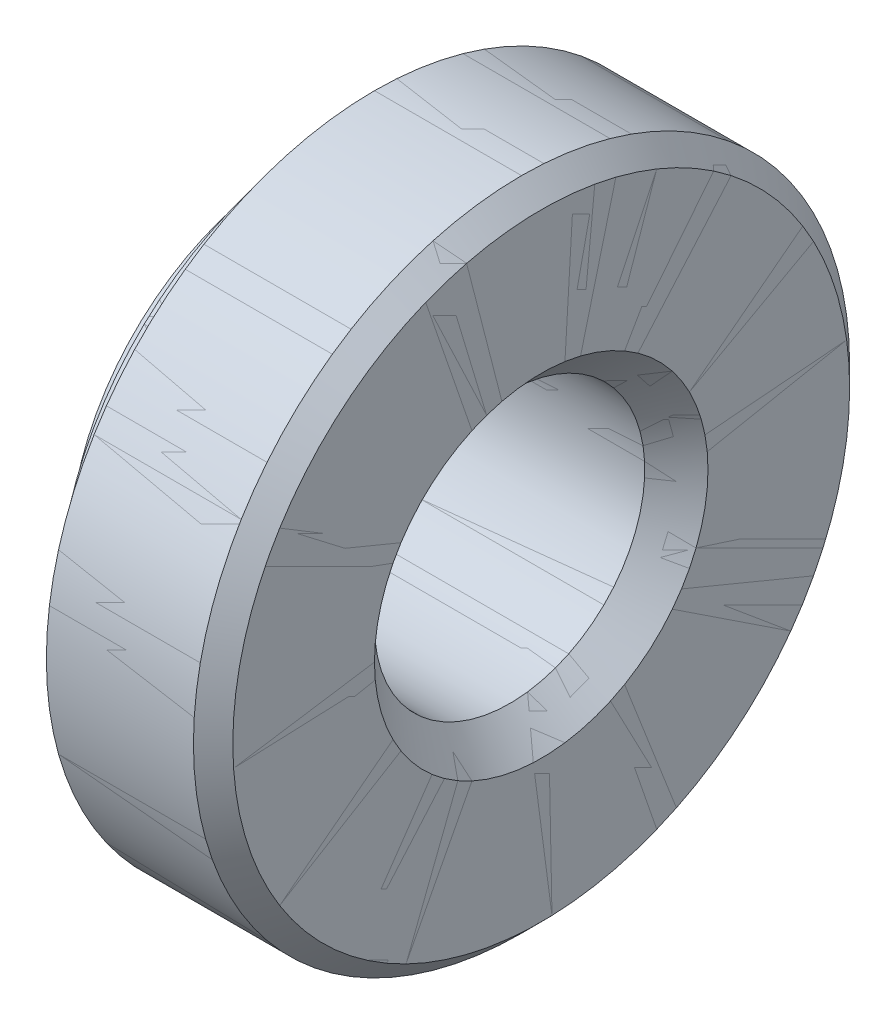
ISO-10303-21;
HEADER;
FILE_DESCRIPTION(('STEP AP214'),'2;1');
FILE_NAME('part.step','',(''),(''),'','','');
FILE_SCHEMA(('AUTOMOTIVE_DESIGN { 1 0 10303 214 1 1 1 1 }'));
ENDSEC;
DATA;
#1=APPLICATION_CONTEXT('core data for automotive mechanical design processes');
#2=APPLICATION_PROTOCOL_DEFINITION('international standard','automotive_design',2000,#1);
#3=PRODUCT_CONTEXT('',#1,'mechanical');
#4=PRODUCT('Part','Part','',(#3));
#5=PRODUCT_RELATED_PRODUCT_CATEGORY('part','',(#4));
#6=PRODUCT_DEFINITION_FORMATION('','',#4);
#7=PRODUCT_DEFINITION_CONTEXT('part definition',#1,'design');
#8=PRODUCT_DEFINITION('design','',#6,#7);
#9=PRODUCT_DEFINITION_SHAPE('','',#8);
#10=(LENGTH_UNIT() NAMED_UNIT(*) SI_UNIT(.MILLI.,.METRE.));
#11=(NAMED_UNIT(*) PLANE_ANGLE_UNIT() SI_UNIT($,.RADIAN.));
#12=(NAMED_UNIT(*) SI_UNIT($,.STERADIAN.) SOLID_ANGLE_UNIT());
#13=UNCERTAINTY_MEASURE_WITH_UNIT(LENGTH_MEASURE(1.E-05),#10,'distance_accuracy_value','');
#14=(GEOMETRIC_REPRESENTATION_CONTEXT(3) GLOBAL_UNCERTAINTY_ASSIGNED_CONTEXT((#13)) GLOBAL_UNIT_ASSIGNED_CONTEXT((#10,
#11,#12)) REPRESENTATION_CONTEXT('',''));
#15=CARTESIAN_POINT('',(0.,0.,0.));
#16=DIRECTION('',(0.,0.,1.));
#17=DIRECTION('',(1.,0.,0.));
#18=AXIS2_PLACEMENT_3D('',#15,#16,#17);
#19=CARTESIAN_POINT('',(2.96999999989112,0.,-3.69890000007445));
#20=DIRECTION('',(-1.,0.,0.));
#21=DIRECTION('',(0.,0.,1.));
#22=AXIS2_PLACEMENT_3D('',#19,#20,#21);
#23=PLANE('',#22);
#24=CARTESIAN_POINT('',(2.96999999989111,0.,0.));
#25=DIRECTION('',(-1.,0.,0.));
#26=DIRECTION('',(0.,0.,1.));
#27=AXIS2_PLACEMENT_3D('',#24,#25,#26);
#28=CIRCLE('',#27,3.69890000007445);
#29=CARTESIAN_POINT('',(2.96999999989111,0.,3.69890000007445));
#30=VERTEX_POINT('',#29);
#31=EDGE_CURVE('E79',#30,#30,#28,.T.);
#32=ORIENTED_EDGE('',*,*,#31,.F.);
#33=EDGE_LOOP('',(#32));
#34=FACE_BOUND('',#33,.T.);
#35=CARTESIAN_POINT('',(2.96999999989111,0.,0.));
#36=DIRECTION('',(-1.,0.,0.));
#37=DIRECTION('',(0.,0.,1.));
#38=AXIS2_PLACEMENT_3D('',#35,#36,#37);
#39=CIRCLE('',#38,1.99999999983442);
#40=CARTESIAN_POINT('',(2.96999999989111,0.,1.99999999983442));
#41=VERTEX_POINT('',#40);
#42=EDGE_CURVE('E11',#41,#41,#39,.T.);
#43=ORIENTED_EDGE('',*,*,#42,.T.);
#44=EDGE_LOOP('',(#43));
#45=FACE_BOUND('',#44,.T.);
#46=ADVANCED_FACE('F39',(#34,#45),#23,.F.);
#47=CARTESIAN_POINT('',(2.59099999999535,0.,0.));
#48=DIRECTION('',(1.,0.,0.));
#49=DIRECTION('',(0.,0.,-1.));
#50=AXIS2_PLACEMENT_3D('',#47,#48,#49);
#51=CONICAL_SURFACE('',#50,1.62099999993865,0.785398163397448);
#52=ORIENTED_EDGE('',*,*,#42,.F.);
#53=EDGE_LOOP('',(#52));
#54=FACE_BOUND('',#53,.T.);
#55=CARTESIAN_POINT('',(2.59099999999535,0.,0.));
#56=DIRECTION('',(-1.,0.,0.));
#57=DIRECTION('',(0.,0.,1.));
#58=AXIS2_PLACEMENT_3D('',#55,#56,#57);
#59=CIRCLE('',#58,1.62099999993865);
#60=CARTESIAN_POINT('',(2.59099999999535,0.,1.62099999993865));
#61=VERTEX_POINT('',#60);
#62=EDGE_CURVE('E45',#61,#61,#59,.T.);
#63=ORIENTED_EDGE('',*,*,#62,.T.);
#64=EDGE_LOOP('',(#63));
#65=FACE_BOUND('',#64,.T.);
#66=ADVANCED_FACE('F86',(#54,#65),#51,.F.);
#67=CARTESIAN_POINT('',(0.,0.,0.));
#68=DIRECTION('',(-1.,0.,0.));
#69=DIRECTION('',(0.,0.,1.));
#70=AXIS2_PLACEMENT_3D('',#67,#68,#69);
#71=CYLINDRICAL_SURFACE('',#70,1.62099999993865);
#72=ORIENTED_EDGE('',*,*,#62,.F.);
#73=EDGE_LOOP('',(#72));
#74=FACE_BOUND('',#73,.T.);
#75=CARTESIAN_POINT('',(0.378999999999999,0.,0.));
#76=DIRECTION('',(-1.,0.,0.));
#77=DIRECTION('',(0.,0.,1.));
#78=AXIS2_PLACEMENT_3D('',#75,#76,#77);
#79=CIRCLE('',#78,1.62099999993865);
#80=CARTESIAN_POINT('',(0.378999999999999,0.,1.62099999993865));
#81=VERTEX_POINT('',#80);
#82=EDGE_CURVE('E49',#81,#81,#79,.T.);
#83=ORIENTED_EDGE('',*,*,#82,.T.);
#84=EDGE_LOOP('',(#83));
#85=FACE_BOUND('',#84,.T.);
#86=ADVANCED_FACE('F90',(#74,#85),#71,.F.);
#87=CARTESIAN_POINT('',(0.,0.,0.));
#88=DIRECTION('',(-1.,0.,0.));
#89=DIRECTION('',(0.,0.,1.));
#90=AXIS2_PLACEMENT_3D('',#87,#88,#89);
#91=CONICAL_SURFACE('',#90,1.99999999993865,0.785398163397448);
#92=ORIENTED_EDGE('',*,*,#82,.F.);
#93=EDGE_LOOP('',(#92));
#94=FACE_BOUND('',#93,.T.);
#95=CARTESIAN_POINT('',(0.,0.,0.));
#96=DIRECTION('',(-1.,0.,0.));
#97=DIRECTION('',(0.,0.,1.));
#98=AXIS2_PLACEMENT_3D('',#95,#96,#97);
#99=CIRCLE('',#98,1.99999999993865);
#100=CARTESIAN_POINT('',(0.,0.,1.99999999993865));
#101=VERTEX_POINT('',#100);
#102=EDGE_CURVE('E53',#101,#101,#99,.T.);
#103=ORIENTED_EDGE('',*,*,#102,.T.);
#104=EDGE_LOOP('',(#103));
#105=FACE_BOUND('',#104,.T.);
#106=ADVANCED_FACE('F95',(#94,#105),#91,.F.);
#107=CARTESIAN_POINT('',(0.,0.,-1.99999999993865));
#108=DIRECTION('',(1.,0.,0.));
#109=DIRECTION('',(0.,0.,-1.));
#110=AXIS2_PLACEMENT_3D('',#107,#108,#109);
#111=PLANE('',#110);
#112=ORIENTED_EDGE('',*,*,#102,.F.);
#113=EDGE_LOOP('',(#112));
#114=FACE_BOUND('',#113,.T.);
#115=CARTESIAN_POINT('',(0.,0.,0.));
#116=DIRECTION('',(-1.,0.,0.));
#117=DIRECTION('',(0.,0.,1.));
#118=AXIS2_PLACEMENT_3D('',#115,#116,#117);
#119=CIRCLE('',#118,2.68999999993236);
#120=CARTESIAN_POINT('',(0.,0.,2.68999999993236));
#121=VERTEX_POINT('',#120);
#122=EDGE_CURVE('E58',#121,#121,#119,.T.);
#123=ORIENTED_EDGE('',*,*,#122,.T.);
#124=EDGE_LOOP('',(#123));
#125=FACE_BOUND('',#124,.T.);
#126=ADVANCED_FACE('F101',(#114,#125),#111,.F.);
#127=CARTESIAN_POINT('',(0.,0.,0.));
#128=DIRECTION('',(-1.,0.,0.));
#129=DIRECTION('',(0.,0.,1.));
#130=AXIS2_PLACEMENT_3D('',#127,#128,#129);
#131=CYLINDRICAL_SURFACE('',#130,2.68999999993236);
#132=ORIENTED_EDGE('',*,*,#122,.F.);
#133=EDGE_LOOP('',(#132));
#134=FACE_BOUND('',#133,.T.);
#135=CARTESIAN_POINT('',(0.22384615387695,0.,0.));
#136=DIRECTION('',(-1.,0.,0.));
#137=DIRECTION('',(0.,0.,1.));
#138=AXIS2_PLACEMENT_3D('',#135,#136,#137);
#139=CIRCLE('',#138,2.68999999993236);
#140=CARTESIAN_POINT('',(0.22384615387695,0.,2.68999999993236));
#141=VERTEX_POINT('',#140);
#142=EDGE_CURVE('E61',#141,#141,#139,.T.);
#143=ORIENTED_EDGE('',*,*,#142,.T.);
#144=EDGE_LOOP('',(#143));
#145=FACE_BOUND('',#144,.T.);
#146=ADVANCED_FACE('F105',(#134,#145),#131,.T.);
#147=CARTESIAN_POINT('',(0.485000000000001,0.,0.));
#148=DIRECTION('',(-1.,0.,0.));
#149=DIRECTION('',(0.,0.,1.));
#150=AXIS2_PLACEMENT_3D('',#147,#148,#149);
#151=CONICAL_SURFACE('',#150,2.64516666659647,0.170016715701493);
#152=ORIENTED_EDGE('',*,*,#142,.F.);
#153=EDGE_LOOP('',(#152));
#154=FACE_BOUND('',#153,.T.);
#155=CARTESIAN_POINT('',(0.485000000000001,0.,0.));
#156=DIRECTION('',(-1.,0.,0.));
#157=DIRECTION('',(0.,0.,1.));
#158=AXIS2_PLACEMENT_3D('',#155,#156,#157);
#159=CIRCLE('',#158,2.64516666659647);
#160=CARTESIAN_POINT('',(0.485,0.,2.64516666659647));
#161=VERTEX_POINT('',#160);
#162=EDGE_CURVE('E64',#161,#161,#159,.T.);
#163=ORIENTED_EDGE('',*,*,#162,.T.);
#164=EDGE_LOOP('',(#163));
#165=FACE_BOUND('',#164,.T.);
#166=ADVANCED_FACE('F109',(#154,#165),#151,.T.);
#167=CARTESIAN_POINT('',(0.485000000000001,0.,-2.64516666659647));
#168=DIRECTION('',(1.,0.,0.));
#169=DIRECTION('',(0.,0.,-1.));
#170=AXIS2_PLACEMENT_3D('',#167,#168,#169);
#171=PLANE('',#170);
#172=ORIENTED_EDGE('',*,*,#162,.F.);
#173=EDGE_LOOP('',(#172));
#174=FACE_BOUND('',#173,.T.);
#175=CARTESIAN_POINT('',(0.485000000000001,0.,0.));
#176=DIRECTION('',(-1.,0.,0.));
#177=DIRECTION('',(0.,0.,1.));
#178=AXIS2_PLACEMENT_3D('',#175,#176,#177);
#179=CIRCLE('',#178,3.3124999999291);
#180=CARTESIAN_POINT('',(0.485,0.,3.3124999999291));
#181=VERTEX_POINT('',#180);
#182=EDGE_CURVE('E67',#181,#181,#179,.T.);
#183=ORIENTED_EDGE('',*,*,#182,.T.);
#184=EDGE_LOOP('',(#183));
#185=FACE_BOUND('',#184,.T.);
#186=ADVANCED_FACE('F113',(#174,#185),#171,.F.);
#187=CARTESIAN_POINT('',(0.,0.,0.));
#188=DIRECTION('',(-1.,0.,0.));
#189=DIRECTION('',(0.,0.,1.));
#190=AXIS2_PLACEMENT_3D('',#187,#188,#189);
#191=CYLINDRICAL_SURFACE('',#190,3.3124999999291);
#192=ORIENTED_EDGE('',*,*,#182,.F.);
#193=EDGE_LOOP('',(#192));
#194=FACE_BOUND('',#193,.T.);
#195=CARTESIAN_POINT('',(0.97,0.,0.));
#196=DIRECTION('',(-1.,0.,0.));
#197=DIRECTION('',(0.,0.,1.));
#198=AXIS2_PLACEMENT_3D('',#195,#196,#197);
#199=CIRCLE('',#198,3.3124999999291);
#200=CARTESIAN_POINT('',(0.97,0.,3.3124999999291));
#201=VERTEX_POINT('',#200);
#202=EDGE_CURVE('E70',#201,#201,#199,.T.);
#203=ORIENTED_EDGE('',*,*,#202,.T.);
#204=EDGE_LOOP('',(#203));
#205=FACE_BOUND('',#204,.T.);
#206=ADVANCED_FACE('F117',(#194,#205),#191,.T.);
#207=CARTESIAN_POINT('',(0.970000000000001,0.,-3.3124999999291));
#208=DIRECTION('',(1.,0.,0.));
#209=DIRECTION('',(0.,0.,-1.));
#210=AXIS2_PLACEMENT_3D('',#207,#208,#209);
#211=PLANE('',#210);
#212=ORIENTED_EDGE('',*,*,#202,.F.);
#213=EDGE_LOOP('',(#212));
#214=FACE_BOUND('',#213,.T.);
#215=CARTESIAN_POINT('',(0.97,0.,0.));
#216=DIRECTION('',(-1.,0.,0.));
#217=DIRECTION('',(0.,0.,1.));
#218=AXIS2_PLACEMENT_3D('',#215,#216,#217);
#219=CIRCLE('',#218,3.93499999997792);
#220=CARTESIAN_POINT('',(0.97,0.,3.93499999997792));
#221=VERTEX_POINT('',#220);
#222=EDGE_CURVE('E73',#221,#221,#219,.T.);
#223=ORIENTED_EDGE('',*,*,#222,.T.);
#224=EDGE_LOOP('',(#223));
#225=FACE_BOUND('',#224,.T.);
#226=ADVANCED_FACE('F121',(#214,#225),#211,.F.);
#227=CARTESIAN_POINT('',(0.,0.,0.));
#228=DIRECTION('',(-1.,0.,0.));
#229=DIRECTION('',(0.,0.,1.));
#230=AXIS2_PLACEMENT_3D('',#227,#228,#229);
#231=CYLINDRICAL_SURFACE('',#230,3.93499999997792);
#232=ORIENTED_EDGE('',*,*,#222,.F.);
#233=EDGE_LOOP('',(#232));
#234=FACE_BOUND('',#233,.T.);
#235=CARTESIAN_POINT('',(2.73389999998764,0.,0.));
#236=DIRECTION('',(-1.,0.,0.));
#237=DIRECTION('',(0.,0.,1.));
#238=AXIS2_PLACEMENT_3D('',#235,#236,#237);
#239=CIRCLE('',#238,3.93499999997792);
#240=CARTESIAN_POINT('',(2.73389999998764,0.,3.93499999997792));
#241=VERTEX_POINT('',#240);
#242=EDGE_CURVE('E76',#241,#241,#239,.T.);
#243=ORIENTED_EDGE('',*,*,#242,.T.);
#244=EDGE_LOOP('',(#243));
#245=FACE_BOUND('',#244,.T.);
#246=ADVANCED_FACE('F125',(#234,#245),#231,.T.);
#247=CARTESIAN_POINT('',(2.96999999989111,0.,0.));
#248=DIRECTION('',(-1.,0.,0.));
#249=DIRECTION('',(0.,0.,1.));
#250=AXIS2_PLACEMENT_3D('',#247,#248,#249);
#251=CONICAL_SURFACE('',#250,3.69890000007445,0.785398163397447);
#252=ORIENTED_EDGE('',*,*,#242,.F.);
#253=EDGE_LOOP('',(#252));
#254=FACE_BOUND('',#253,.T.);
#255=ORIENTED_EDGE('',*,*,#31,.T.);
#256=EDGE_LOOP('',(#255));
#257=FACE_BOUND('',#256,.T.);
#258=ADVANCED_FACE('F83',(#254,#257),#251,.T.);
#259=CLOSED_SHELL('',(#46,#66,#86,#106,#126,#146,#166,#186,#206,#226,#246,#258));
#260=MANIFOLD_SOLID_BREP('B2',#259);
#261=CARTESIAN_POINT('',(2.73389999998764,0.,0.));
#262=DIRECTION('',(-1.,0.,0.));
#263=DIRECTION('',(0.,0.,1.));
#264=AXIS2_PLACEMENT_3D('',#261,#262,#263);
#265=CONICAL_SURFACE('',#264,3.93499999997792,0.785398163397447);
#266=CARTESIAN_POINT('',(2.96999999989111,0.,0.));
#267=DIRECTION('',(-1.,0.,0.));
#268=DIRECTION('',(0.,0.,1.));
#269=AXIS2_PLACEMENT_3D('',#266,#267,#268);
#270=CIRCLE('',#269,3.69890000007445);
#271=CARTESIAN_POINT('',(2.96999999989111,0.,3.69890000007445));
#272=VERTEX_POINT('',#271);
#273=EDGE_CURVE('E38',#272,#272,#270,.T.);
#274=ORIENTED_EDGE('',*,*,#273,.T.);
#275=EDGE_LOOP('',(#274));
#276=FACE_BOUND('',#275,.T.);
#277=CARTESIAN_POINT('',(2.73389999998764,0.,0.));
#278=DIRECTION('',(-1.,0.,0.));
#279=DIRECTION('',(0.,0.,1.));
#280=AXIS2_PLACEMENT_3D('',#277,#278,#279);
#281=CIRCLE('',#280,3.93499999997792);
#282=CARTESIAN_POINT('',(2.73389999998764,0.,3.93499999997792));
#283=VERTEX_POINT('',#282);
#284=EDGE_CURVE('E261',#283,#283,#281,.T.);
#285=ORIENTED_EDGE('',*,*,#284,.F.);
#286=EDGE_LOOP('',(#285));
#287=FACE_BOUND('',#286,.T.);
#288=ADVANCED_FACE('F221',(#276,#287),#265,.T.);
#289=CARTESIAN_POINT('',(2.96999999989111,0.,3.69890000007445));
#290=DIRECTION('',(1.,0.,0.));
#291=DIRECTION('',(0.,0.,-1.));
#292=AXIS2_PLACEMENT_3D('',#289,#290,#291);
#293=PLANE('',#292);
#294=CARTESIAN_POINT('',(2.96999999989111,0.,0.));
#295=DIRECTION('',(-1.,0.,0.));
#296=DIRECTION('',(0.,0.,1.));
#297=AXIS2_PLACEMENT_3D('',#294,#295,#296);
#298=CIRCLE('',#297,1.99999999983442);
#299=CARTESIAN_POINT('',(2.96999999989111,0.,1.99999999983442));
#300=VERTEX_POINT('',#299);
#301=EDGE_CURVE('E227',#300,#300,#298,.T.);
#302=ORIENTED_EDGE('',*,*,#301,.T.);
#303=EDGE_LOOP('',(#302));
#304=FACE_BOUND('',#303,.T.);
#305=ORIENTED_EDGE('',*,*,#273,.F.);
#306=EDGE_LOOP('',(#305));
#307=FACE_BOUND('',#306,.T.);
#308=ADVANCED_FACE('F269',(#304,#307),#293,.T.);
#309=CARTESIAN_POINT('',(2.96999999989111,0.,0.));
#310=DIRECTION('',(1.,0.,0.));
#311=DIRECTION('',(0.,0.,-1.));
#312=AXIS2_PLACEMENT_3D('',#309,#310,#311);
#313=CONICAL_SURFACE('',#312,1.99999999983442,0.785398163397448);
#314=CARTESIAN_POINT('',(2.59099999999535,0.,0.));
#315=DIRECTION('',(-1.,0.,0.));
#316=DIRECTION('',(0.,0.,1.));
#317=AXIS2_PLACEMENT_3D('',#314,#315,#316);
#318=CIRCLE('',#317,1.62099999993865);
#319=CARTESIAN_POINT('',(2.59099999999535,0.,1.62099999993865));
#320=VERTEX_POINT('',#319);
#321=EDGE_CURVE('E231',#320,#320,#318,.T.);
#322=ORIENTED_EDGE('',*,*,#321,.T.);
#323=EDGE_LOOP('',(#322));
#324=FACE_BOUND('',#323,.T.);
#325=ORIENTED_EDGE('',*,*,#301,.F.);
#326=EDGE_LOOP('',(#325));
#327=FACE_BOUND('',#326,.T.);
#328=ADVANCED_FACE('F273',(#324,#327),#313,.F.);
#329=CARTESIAN_POINT('',(0.,0.,0.));
#330=DIRECTION('',(-1.,0.,0.));
#331=DIRECTION('',(0.,0.,1.));
#332=AXIS2_PLACEMENT_3D('',#329,#330,#331);
#333=CYLINDRICAL_SURFACE('',#332,1.62099999993865);
#334=CARTESIAN_POINT('',(0.378999999999999,0.,0.));
#335=DIRECTION('',(-1.,0.,0.));
#336=DIRECTION('',(0.,0.,1.));
#337=AXIS2_PLACEMENT_3D('',#334,#335,#336);
#338=CIRCLE('',#337,1.62099999993865);
#339=CARTESIAN_POINT('',(0.378999999999999,0.,1.62099999993865));
#340=VERTEX_POINT('',#339);
#341=EDGE_CURVE('E235',#340,#340,#338,.T.);
#342=ORIENTED_EDGE('',*,*,#341,.T.);
#343=EDGE_LOOP('',(#342));
#344=FACE_BOUND('',#343,.T.);
#345=ORIENTED_EDGE('',*,*,#321,.F.);
#346=EDGE_LOOP('',(#345));
#347=FACE_BOUND('',#346,.T.);
#348=ADVANCED_FACE('F277',(#344,#347),#333,.F.);
#349=CARTESIAN_POINT('',(0.378999999999999,0.,0.));
#350=DIRECTION('',(-1.,0.,0.));
#351=DIRECTION('',(0.,0.,1.));
#352=AXIS2_PLACEMENT_3D('',#349,#350,#351);
#353=CONICAL_SURFACE('',#352,1.62099999993865,0.785398163397448);
#354=CARTESIAN_POINT('',(0.,0.,0.));
#355=DIRECTION('',(-1.,0.,0.));
#356=DIRECTION('',(0.,0.,1.));
#357=AXIS2_PLACEMENT_3D('',#354,#355,#356);
#358=CIRCLE('',#357,1.99999999993865);
#359=CARTESIAN_POINT('',(0.,0.,1.99999999993865));
#360=VERTEX_POINT('',#359);
#361=EDGE_CURVE('E240',#360,#360,#358,.T.);
#362=ORIENTED_EDGE('',*,*,#361,.T.);
#363=EDGE_LOOP('',(#362));
#364=FACE_BOUND('',#363,.T.);
#365=ORIENTED_EDGE('',*,*,#341,.F.);
#366=EDGE_LOOP('',(#365));
#367=FACE_BOUND('',#366,.T.);
#368=ADVANCED_FACE('F284',(#364,#367),#353,.F.);
#369=CARTESIAN_POINT('',(0.,0.,1.99999999993865));
#370=DIRECTION('',(-1.,0.,0.));
#371=DIRECTION('',(0.,0.,1.));
#372=AXIS2_PLACEMENT_3D('',#369,#370,#371);
#373=PLANE('',#372);
#374=CARTESIAN_POINT('',(0.,0.,0.));
#375=DIRECTION('',(-1.,0.,0.));
#376=DIRECTION('',(0.,0.,1.));
#377=AXIS2_PLACEMENT_3D('',#374,#375,#376);
#378=CIRCLE('',#377,2.68999999993236);
#379=CARTESIAN_POINT('',(0.,0.,2.68999999993236));
#380=VERTEX_POINT('',#379);
#381=EDGE_CURVE('E243',#380,#380,#378,.T.);
#382=ORIENTED_EDGE('',*,*,#381,.T.);
#383=EDGE_LOOP('',(#382));
#384=FACE_BOUND('',#383,.T.);
#385=ORIENTED_EDGE('',*,*,#361,.F.);
#386=EDGE_LOOP('',(#385));
#387=FACE_BOUND('',#386,.T.);
#388=ADVANCED_FACE('F288',(#384,#387),#373,.T.);
#389=CARTESIAN_POINT('',(0.,0.,0.));
#390=DIRECTION('',(-1.,0.,0.));
#391=DIRECTION('',(0.,0.,1.));
#392=AXIS2_PLACEMENT_3D('',#389,#390,#391);
#393=CYLINDRICAL_SURFACE('',#392,2.68999999993236);
#394=CARTESIAN_POINT('',(0.22384615387695,0.,0.));
#395=DIRECTION('',(-1.,0.,0.));
#396=DIRECTION('',(0.,0.,1.));
#397=AXIS2_PLACEMENT_3D('',#394,#395,#396);
#398=CIRCLE('',#397,2.68999999993236);
#399=CARTESIAN_POINT('',(0.22384615387695,0.,2.68999999993236));
#400=VERTEX_POINT('',#399);
#401=EDGE_CURVE('E246',#400,#400,#398,.T.);
#402=ORIENTED_EDGE('',*,*,#401,.T.);
#403=EDGE_LOOP('',(#402));
#404=FACE_BOUND('',#403,.T.);
#405=ORIENTED_EDGE('',*,*,#381,.F.);
#406=EDGE_LOOP('',(#405));
#407=FACE_BOUND('',#406,.T.);
#408=ADVANCED_FACE('F292',(#404,#407),#393,.T.);
#409=CARTESIAN_POINT('',(0.22384615387695,0.,0.));
#410=DIRECTION('',(-1.,0.,0.));
#411=DIRECTION('',(0.,0.,1.));
#412=AXIS2_PLACEMENT_3D('',#409,#410,#411);
#413=CONICAL_SURFACE('',#412,2.68999999993236,0.170016715701493);
#414=CARTESIAN_POINT('',(0.485000000000001,0.,0.));
#415=DIRECTION('',(-1.,0.,0.));
#416=DIRECTION('',(0.,0.,1.));
#417=AXIS2_PLACEMENT_3D('',#414,#415,#416);
#418=CIRCLE('',#417,2.64516666659647);
#419=CARTESIAN_POINT('',(0.485,0.,2.64516666659647));
#420=VERTEX_POINT('',#419);
#421=EDGE_CURVE('E249',#420,#420,#418,.T.);
#422=ORIENTED_EDGE('',*,*,#421,.T.);
#423=EDGE_LOOP('',(#422));
#424=FACE_BOUND('',#423,.T.);
#425=ORIENTED_EDGE('',*,*,#401,.F.);
#426=EDGE_LOOP('',(#425));
#427=FACE_BOUND('',#426,.T.);
#428=ADVANCED_FACE('F296',(#424,#427),#413,.T.);
#429=CARTESIAN_POINT('',(0.485,0.,2.64516666659647));
#430=DIRECTION('',(-1.,0.,0.));
#431=DIRECTION('',(0.,0.,1.));
#432=AXIS2_PLACEMENT_3D('',#429,#430,#431);
#433=PLANE('',#432);
#434=CARTESIAN_POINT('',(0.485000000000001,0.,0.));
#435=DIRECTION('',(-1.,0.,0.));
#436=DIRECTION('',(0.,0.,1.));
#437=AXIS2_PLACEMENT_3D('',#434,#435,#436);
#438=CIRCLE('',#437,3.3124999999291);
#439=CARTESIAN_POINT('',(0.485,0.,3.3124999999291));
#440=VERTEX_POINT('',#439);
#441=EDGE_CURVE('E252',#440,#440,#438,.T.);
#442=ORIENTED_EDGE('',*,*,#441,.T.);
#443=EDGE_LOOP('',(#442));
#444=FACE_BOUND('',#443,.T.);
#445=ORIENTED_EDGE('',*,*,#421,.F.);
#446=EDGE_LOOP('',(#445));
#447=FACE_BOUND('',#446,.T.);
#448=ADVANCED_FACE('F300',(#444,#447),#433,.T.);
#449=CARTESIAN_POINT('',(0.,0.,0.));
#450=DIRECTION('',(-1.,0.,0.));
#451=DIRECTION('',(0.,0.,1.));
#452=AXIS2_PLACEMENT_3D('',#449,#450,#451);
#453=CYLINDRICAL_SURFACE('',#452,3.3124999999291);
#454=CARTESIAN_POINT('',(0.97,0.,0.));
#455=DIRECTION('',(-1.,0.,0.));
#456=DIRECTION('',(0.,0.,1.));
#457=AXIS2_PLACEMENT_3D('',#454,#455,#456);
#458=CIRCLE('',#457,3.3124999999291);
#459=CARTESIAN_POINT('',(0.97,0.,3.3124999999291));
#460=VERTEX_POINT('',#459);
#461=EDGE_CURVE('E255',#460,#460,#458,.T.);
#462=ORIENTED_EDGE('',*,*,#461,.T.);
#463=EDGE_LOOP('',(#462));
#464=FACE_BOUND('',#463,.T.);
#465=ORIENTED_EDGE('',*,*,#441,.F.);
#466=EDGE_LOOP('',(#465));
#467=FACE_BOUND('',#466,.T.);
#468=ADVANCED_FACE('F304',(#464,#467),#453,.T.);
#469=CARTESIAN_POINT('',(0.97,0.,3.3124999999291));
#470=DIRECTION('',(-1.,0.,0.));
#471=DIRECTION('',(0.,0.,1.));
#472=AXIS2_PLACEMENT_3D('',#469,#470,#471);
#473=PLANE('',#472);
#474=CARTESIAN_POINT('',(0.97,0.,0.));
#475=DIRECTION('',(-1.,0.,0.));
#476=DIRECTION('',(0.,0.,1.));
#477=AXIS2_PLACEMENT_3D('',#474,#475,#476);
#478=CIRCLE('',#477,3.93499999997792);
#479=CARTESIAN_POINT('',(0.97,0.,3.93499999997792));
#480=VERTEX_POINT('',#479);
#481=EDGE_CURVE('E258',#480,#480,#478,.T.);
#482=ORIENTED_EDGE('',*,*,#481,.T.);
#483=EDGE_LOOP('',(#482));
#484=FACE_BOUND('',#483,.T.);
#485=ORIENTED_EDGE('',*,*,#461,.F.);
#486=EDGE_LOOP('',(#485));
#487=FACE_BOUND('',#486,.T.);
#488=ADVANCED_FACE('F308',(#484,#487),#473,.T.);
#489=CARTESIAN_POINT('',(0.,0.,0.));
#490=DIRECTION('',(-1.,0.,0.));
#491=DIRECTION('',(0.,0.,1.));
#492=AXIS2_PLACEMENT_3D('',#489,#490,#491);
#493=CYLINDRICAL_SURFACE('',#492,3.93499999997792);
#494=ORIENTED_EDGE('',*,*,#284,.T.);
#495=EDGE_LOOP('',(#494));
#496=FACE_BOUND('',#495,.T.);
#497=ORIENTED_EDGE('',*,*,#481,.F.);
#498=EDGE_LOOP('',(#497));
#499=FACE_BOUND('',#498,.T.);
#500=ADVANCED_FACE('F265',(#496,#499),#493,.T.);
#501=CLOSED_SHELL('',(#288,#308,#328,#348,#368,#388,#408,#428,#448,#468,#488,#500));
#502=MANIFOLD_SOLID_BREP('B6',#501);
#503=ADVANCED_BREP_SHAPE_REPRESENTATION('',(#18,#260,#502),#14);
#504=SHAPE_DEFINITION_REPRESENTATION(#9,#503);
ENDSEC;
END-ISO-10303-21;
